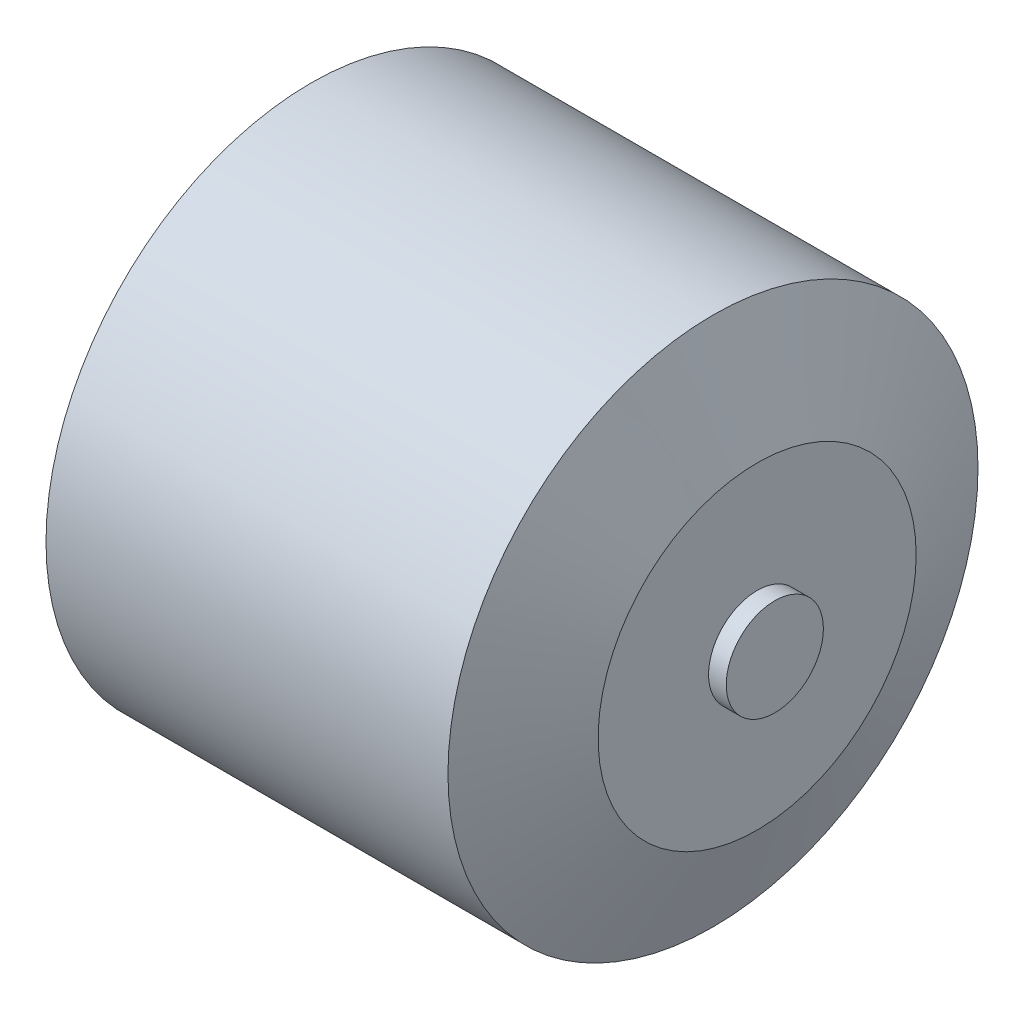
ISO-10303-21;
HEADER;
FILE_DESCRIPTION(('STEP AP214'),'2;1');
FILE_NAME('part.step','',(''),(''),'','','');
FILE_SCHEMA(('AUTOMOTIVE_DESIGN { 1 0 10303 214 1 1 1 1 }'));
ENDSEC;
DATA;
#1=APPLICATION_CONTEXT('core data for automotive mechanical design processes');
#2=APPLICATION_PROTOCOL_DEFINITION('international standard','automotive_design',2000,#1);
#3=PRODUCT_CONTEXT('',#1,'mechanical');
#4=PRODUCT('Part','Part','',(#3));
#5=PRODUCT_RELATED_PRODUCT_CATEGORY('part','',(#4));
#6=PRODUCT_DEFINITION_FORMATION('','',#4);
#7=PRODUCT_DEFINITION_CONTEXT('part definition',#1,'design');
#8=PRODUCT_DEFINITION('design','',#6,#7);
#9=PRODUCT_DEFINITION_SHAPE('','',#8);
#10=(LENGTH_UNIT() NAMED_UNIT(*) SI_UNIT(.MILLI.,.METRE.));
#11=(NAMED_UNIT(*) PLANE_ANGLE_UNIT() SI_UNIT($,.RADIAN.));
#12=(NAMED_UNIT(*) SI_UNIT($,.STERADIAN.) SOLID_ANGLE_UNIT());
#13=UNCERTAINTY_MEASURE_WITH_UNIT(LENGTH_MEASURE(1.E-05),#10,'distance_accuracy_value','');
#14=(GEOMETRIC_REPRESENTATION_CONTEXT(3) GLOBAL_UNCERTAINTY_ASSIGNED_CONTEXT((#13)) GLOBAL_UNIT_ASSIGNED_CONTEXT((#10,
#11,#12)) REPRESENTATION_CONTEXT('',''));
#15=CARTESIAN_POINT('',(0.,0.,0.));
#16=DIRECTION('',(0.,0.,1.));
#17=DIRECTION('',(1.,0.,0.));
#18=AXIS2_PLACEMENT_3D('',#15,#16,#17);
#19=CARTESIAN_POINT('',(95.,0.,0.));
#20=DIRECTION('',(-1.,0.,0.));
#21=DIRECTION('',(0.,0.,1.));
#22=AXIS2_PLACEMENT_3D('',#19,#20,#21);
#23=CYLINDRICAL_SURFACE('',#22,60.);
#24=CARTESIAN_POINT('',(95.,0.,0.));
#25=DIRECTION('',(1.,0.,0.));
#26=DIRECTION('',(0.,0.,-1.));
#27=AXIS2_PLACEMENT_3D('',#24,#25,#26);
#28=CIRCLE('',#27,60.);
#29=CARTESIAN_POINT('',(95.,0.,-60.));
#30=VERTEX_POINT('',#29);
#31=EDGE_CURVE('E56',#30,#30,#28,.T.);
#32=ORIENTED_EDGE('',*,*,#31,.F.);
#33=EDGE_LOOP('',(#32));
#34=FACE_BOUND('',#33,.T.);
#35=CARTESIAN_POINT('',(4.,0.,0.));
#36=DIRECTION('',(1.,0.,0.));
#37=DIRECTION('',(0.,0.,-1.));
#38=AXIS2_PLACEMENT_3D('',#35,#36,#37);
#39=CIRCLE('',#38,60.);
#40=CARTESIAN_POINT('',(4.,0.,-60.));
#41=VERTEX_POINT('',#40);
#42=EDGE_CURVE('E50',#41,#41,#39,.T.);
#43=ORIENTED_EDGE('',*,*,#42,.T.);
#44=EDGE_LOOP('',(#43));
#45=FACE_BOUND('',#44,.T.);
#46=ADVANCED_FACE('F47',(#34,#45),#23,.T.);
#47=CARTESIAN_POINT('',(4.,0.,0.));
#48=DIRECTION('',(1.,0.,0.));
#49=DIRECTION('',(0.,0.,-1.));
#50=AXIS2_PLACEMENT_3D('',#47,#48,#49);
#51=PLANE('',#50);
#52=CARTESIAN_POINT('',(4.,0.,0.));
#53=DIRECTION('',(-1.,0.,0.));
#54=DIRECTION('',(0.,0.,1.));
#55=AXIS2_PLACEMENT_3D('',#52,#53,#54);
#56=CIRCLE('',#55,47.5);
#57=CARTESIAN_POINT('',(4.,0.,47.5));
#58=VERTEX_POINT('',#57);
#59=EDGE_CURVE('E11',#58,#58,#56,.T.);
#60=ORIENTED_EDGE('',*,*,#59,.F.);
#61=EDGE_LOOP('',(#60));
#62=FACE_BOUND('',#61,.T.);
#63=ORIENTED_EDGE('',*,*,#42,.F.);
#64=EDGE_LOOP('',(#63));
#65=FACE_BOUND('',#64,.T.);
#66=ADVANCED_FACE('F246',(#62,#65),#51,.F.);
#67=CARTESIAN_POINT('',(109.,0.,0.));
#68=DIRECTION('',(1.,0.,0.));
#69=DIRECTION('',(0.,0.,-1.));
#70=AXIS2_PLACEMENT_3D('',#67,#68,#69);
#71=PLANE('',#70);
#72=CARTESIAN_POINT('',(109.,0.,0.));
#73=DIRECTION('',(1.,0.,0.));
#74=DIRECTION('',(0.,0.,-1.));
#75=AXIS2_PLACEMENT_3D('',#72,#73,#74);
#76=CIRCLE('',#75,11.);
#77=CARTESIAN_POINT('',(109.,0.,-11.));
#78=VERTEX_POINT('',#77);
#79=EDGE_CURVE('E234',#78,#78,#76,.T.);
#80=ORIENTED_EDGE('',*,*,#79,.T.);
#81=EDGE_LOOP('',(#80));
#82=FACE_BOUND('',#81,.T.);
#83=ADVANCED_FACE('F248',(#82),#71,.T.);
#84=CARTESIAN_POINT('',(95.,0.,0.));
#85=DIRECTION('',(1.,0.,0.));
#86=DIRECTION('',(0.,0.,-1.));
#87=AXIS2_PLACEMENT_3D('',#84,#85,#86);
#88=CYLINDRICAL_SURFACE('',#87,11.);
#89=CARTESIAN_POINT('',(105.,0.,0.));
#90=DIRECTION('',(1.,0.,0.));
#91=DIRECTION('',(0.,0.,-1.));
#92=AXIS2_PLACEMENT_3D('',#89,#90,#91);
#93=CIRCLE('',#92,11.);
#94=CARTESIAN_POINT('',(105.,0.,-11.));
#95=VERTEX_POINT('',#94);
#96=EDGE_CURVE('E230',#95,#95,#93,.T.);
#97=ORIENTED_EDGE('',*,*,#96,.T.);
#98=EDGE_LOOP('',(#97));
#99=FACE_BOUND('',#98,.T.);
#100=ORIENTED_EDGE('',*,*,#79,.F.);
#101=EDGE_LOOP('',(#100));
#102=FACE_BOUND('',#101,.T.);
#103=ADVANCED_FACE('F257',(#99,#102),#88,.T.);
#104=CARTESIAN_POINT('',(105.,36.,0.));
#105=DIRECTION('',(1.,0.,0.));
#106=DIRECTION('',(0.,0.,-1.));
#107=AXIS2_PLACEMENT_3D('',#104,#105,#106);
#108=PLANE('',#107);
#109=CARTESIAN_POINT('',(105.,0.,0.));
#110=DIRECTION('',(1.,0.,0.));
#111=DIRECTION('',(0.,0.,-1.));
#112=AXIS2_PLACEMENT_3D('',#109,#110,#111);
#113=CIRCLE('',#112,36.);
#114=CARTESIAN_POINT('',(105.,0.,-36.));
#115=VERTEX_POINT('',#114);
#116=EDGE_CURVE('E225',#115,#115,#113,.T.);
#117=ORIENTED_EDGE('',*,*,#116,.T.);
#118=EDGE_LOOP('',(#117));
#119=FACE_BOUND('',#118,.T.);
#120=ORIENTED_EDGE('',*,*,#96,.F.);
#121=EDGE_LOOP('',(#120));
#122=FACE_BOUND('',#121,.T.);
#123=ADVANCED_FACE('F338',(#119,#122),#108,.T.);
#124=CARTESIAN_POINT('',(105.,0.,0.));
#125=DIRECTION('',(-1.,0.,0.));
#126=DIRECTION('',(0.,0.,1.));
#127=AXIS2_PLACEMENT_3D('',#124,#125,#126);
#128=CONICAL_SURFACE('',#127,36.,1.17600520709514);
#129=ORIENTED_EDGE('',*,*,#31,.T.);
#130=EDGE_LOOP('',(#129));
#131=FACE_BOUND('',#130,.T.);
#132=ORIENTED_EDGE('',*,*,#116,.F.);
#133=EDGE_LOOP('',(#132));
#134=FACE_BOUND('',#133,.T.);
#135=ADVANCED_FACE('F333',(#131,#134),#128,.T.);
#136=CARTESIAN_POINT('',(0.,0.,0.));
#137=DIRECTION('',(-1.,0.,0.));
#138=DIRECTION('',(0.,0.,1.));
#139=AXIS2_PLACEMENT_3D('',#136,#137,#138);
#140=PLANE('',#139);
#141=CARTESIAN_POINT('',(0.,0.,0.));
#142=DIRECTION('',(-1.,0.,0.));
#143=DIRECTION('',(0.,0.,1.));
#144=AXIS2_PLACEMENT_3D('',#141,#142,#143);
#145=CIRCLE('',#144,5.99999999999999);
#146=CARTESIAN_POINT('',(0.,0.,5.99999999999999));
#147=VERTEX_POINT('',#146);
#148=EDGE_CURVE('E130',#147,#147,#145,.T.);
#149=ORIENTED_EDGE('',*,*,#148,.F.);
#150=EDGE_LOOP('',(#149));
#151=FACE_BOUND('',#150,.T.);
#152=CARTESIAN_POINT('',(0.,7.76457135307562,28.9777747886721));
#153=DIRECTION('',(-1.,0.,0.));
#154=DIRECTION('',(0.,0.,1.));
#155=AXIS2_PLACEMENT_3D('',#152,#153,#154);
#156=CIRCLE('',#155,2.25);
#157=CARTESIAN_POINT('',(0.,7.76457135307562,31.2277747886721));
#158=VERTEX_POINT('',#157);
#159=EDGE_CURVE('E151',#158,#158,#156,.T.);
#160=ORIENTED_EDGE('',*,*,#159,.F.);
#161=EDGE_LOOP('',(#160));
#162=FACE_BOUND('',#161,.T.);
#163=CARTESIAN_POINT('',(0.,28.9777747886721,7.76457135307562));
#164=DIRECTION('',(-1.,0.,0.));
#165=DIRECTION('',(0.,0.,1.));
#166=AXIS2_PLACEMENT_3D('',#163,#164,#165);
#167=CIRCLE('',#166,2.24999999999999);
#168=CARTESIAN_POINT('',(0.,28.9777747886721,10.0145713530756));
#169=VERTEX_POINT('',#168);
#170=EDGE_CURVE('E167',#169,#169,#167,.T.);
#171=ORIENTED_EDGE('',*,*,#170,.F.);
#172=EDGE_LOOP('',(#171));
#173=FACE_BOUND('',#172,.T.);
#174=CARTESIAN_POINT('',(0.,21.2132034355964,-21.2132034355964));
#175=DIRECTION('',(-1.,0.,0.));
#176=DIRECTION('',(0.,0.,1.));
#177=AXIS2_PLACEMENT_3D('',#174,#175,#176);
#178=CIRCLE('',#177,2.25);
#179=CARTESIAN_POINT('',(0.,21.2132034355964,-18.9632034355964));
#180=VERTEX_POINT('',#179);
#181=EDGE_CURVE('E183',#180,#180,#178,.T.);
#182=ORIENTED_EDGE('',*,*,#181,.F.);
#183=EDGE_LOOP('',(#182));
#184=FACE_BOUND('',#183,.T.);
#185=CARTESIAN_POINT('',(0.,-7.76457135307565,-28.977774788672));
#186=DIRECTION('',(-1.,0.,0.));
#187=DIRECTION('',(0.,0.,1.));
#188=AXIS2_PLACEMENT_3D('',#185,#186,#187);
#189=CIRCLE('',#188,2.25);
#190=CARTESIAN_POINT('',(0.,-7.76457135307565,-26.727774788672));
#191=VERTEX_POINT('',#190);
#192=EDGE_CURVE('E199',#191,#191,#189,.T.);
#193=ORIENTED_EDGE('',*,*,#192,.F.);
#194=EDGE_LOOP('',(#193));
#195=FACE_BOUND('',#194,.T.);
#196=CARTESIAN_POINT('',(0.,-21.2132034355964,21.2132034355964));
#197=DIRECTION('',(-1.,0.,0.));
#198=DIRECTION('',(0.,0.,1.));
#199=AXIS2_PLACEMENT_3D('',#196,#197,#198);
#200=CIRCLE('',#199,2.25);
#201=CARTESIAN_POINT('',(0.,-21.2132034355964,23.4632034355964));
#202=VERTEX_POINT('',#201);
#203=EDGE_CURVE('E215',#202,#202,#200,.T.);
#204=ORIENTED_EDGE('',*,*,#203,.F.);
#205=EDGE_LOOP('',(#204));
#206=FACE_BOUND('',#205,.T.);
#207=CARTESIAN_POINT('',(0.,0.,0.));
#208=DIRECTION('',(-1.,0.,0.));
#209=DIRECTION('',(0.,0.,1.));
#210=AXIS2_PLACEMENT_3D('',#207,#208,#209);
#211=CIRCLE('',#210,47.5);
#212=CARTESIAN_POINT('',(0.,0.,47.5));
#213=VERTEX_POINT('',#212);
#214=EDGE_CURVE('E219',#213,#213,#211,.T.);
#215=ORIENTED_EDGE('',*,*,#214,.T.);
#216=EDGE_LOOP('',(#215));
#217=FACE_BOUND('',#216,.T.);
#218=CARTESIAN_POINT('',(0.,-21.2132034355964,-21.2132034355964));
#219=DIRECTION('',(-1.,0.,0.));
#220=DIRECTION('',(0.,0.,1.));
#221=AXIS2_PLACEMENT_3D('',#218,#219,#220);
#222=CIRCLE('',#221,2.25);
#223=CARTESIAN_POINT('',(0.,-21.2132034355964,-18.9632034355964));
#224=VERTEX_POINT('',#223);
#225=EDGE_CURVE('E207',#224,#224,#222,.T.);
#226=ORIENTED_EDGE('',*,*,#225,.F.);
#227=EDGE_LOOP('',(#226));
#228=FACE_BOUND('',#227,.T.);
#229=CARTESIAN_POINT('',(0.,7.76457135307559,-28.977774788672));
#230=DIRECTION('',(-1.,0.,0.));
#231=DIRECTION('',(0.,0.,1.));
#232=AXIS2_PLACEMENT_3D('',#229,#230,#231);
#233=CIRCLE('',#232,2.25000000000001);
#234=CARTESIAN_POINT('',(0.,7.76457135307559,-26.727774788672));
#235=VERTEX_POINT('',#234);
#236=EDGE_CURVE('E191',#235,#235,#233,.T.);
#237=ORIENTED_EDGE('',*,*,#236,.F.);
#238=EDGE_LOOP('',(#237));
#239=FACE_BOUND('',#238,.T.);
#240=CARTESIAN_POINT('',(0.,28.977774788672,-7.76457135307565));
#241=DIRECTION('',(-1.,0.,0.));
#242=DIRECTION('',(0.,0.,1.));
#243=AXIS2_PLACEMENT_3D('',#240,#241,#242);
#244=CIRCLE('',#243,2.24999999999998);
#245=CARTESIAN_POINT('',(0.,28.977774788672,-5.51457135307567));
#246=VERTEX_POINT('',#245);
#247=EDGE_CURVE('E175',#246,#246,#244,.T.);
#248=ORIENTED_EDGE('',*,*,#247,.F.);
#249=EDGE_LOOP('',(#248));
#250=FACE_BOUND('',#249,.T.);
#251=CARTESIAN_POINT('',(0.,21.2132034355964,21.2132034355964));
#252=DIRECTION('',(-1.,0.,0.));
#253=DIRECTION('',(0.,0.,1.));
#254=AXIS2_PLACEMENT_3D('',#251,#252,#253);
#255=CIRCLE('',#254,2.25);
#256=CARTESIAN_POINT('',(0.,21.2132034355964,23.4632034355964));
#257=VERTEX_POINT('',#256);
#258=EDGE_CURVE('E159',#257,#257,#255,.T.);
#259=ORIENTED_EDGE('',*,*,#258,.F.);
#260=EDGE_LOOP('',(#259));
#261=FACE_BOUND('',#260,.T.);
#262=CARTESIAN_POINT('',(0.,-7.76457135307562,28.9777747886721));
#263=DIRECTION('',(-1.,0.,0.));
#264=DIRECTION('',(0.,0.,1.));
#265=AXIS2_PLACEMENT_3D('',#262,#263,#264);
#266=CIRCLE('',#265,2.25);
#267=CARTESIAN_POINT('',(0.,-7.76457135307562,31.2277747886721));
#268=VERTEX_POINT('',#267);
#269=EDGE_CURVE('E143',#268,#268,#266,.T.);
#270=ORIENTED_EDGE('',*,*,#269,.F.);
#271=EDGE_LOOP('',(#270));
#272=FACE_BOUND('',#271,.T.);
#273=ADVANCED_FACE('F331',(#151,#162,#173,#184,#195,#206,#217,#228,#239,#250,#261,#272),#140,.T.);
#274=CARTESIAN_POINT('',(0.,0.,0.));
#275=DIRECTION('',(1.,0.,0.));
#276=DIRECTION('',(0.,0.,-1.));
#277=AXIS2_PLACEMENT_3D('',#274,#275,#276);
#278=CYLINDRICAL_SURFACE('',#277,47.5);
#279=ORIENTED_EDGE('',*,*,#214,.F.);
#280=EDGE_LOOP('',(#279));
#281=FACE_BOUND('',#280,.T.);
#282=ORIENTED_EDGE('',*,*,#59,.T.);
#283=EDGE_LOOP('',(#282));
#284=FACE_BOUND('',#283,.T.);
#285=ADVANCED_FACE('F329',(#281,#284),#278,.T.);
#286=CARTESIAN_POINT('',(0.,-21.2132034355964,21.2132034355964));
#287=DIRECTION('',(1.,0.,0.));
#288=DIRECTION('',(0.,0.,-1.));
#289=AXIS2_PLACEMENT_3D('',#286,#287,#288);
#290=CYLINDRICAL_SURFACE('',#289,2.25);
#291=ORIENTED_EDGE('',*,*,#203,.T.);
#292=EDGE_LOOP('',(#291));
#293=FACE_BOUND('',#292,.T.);
#294=CARTESIAN_POINT('',(4.,-21.2132034355964,21.2132034355964));
#295=DIRECTION('',(-1.,0.,0.));
#296=DIRECTION('',(0.,0.,1.));
#297=AXIS2_PLACEMENT_3D('',#294,#295,#296);
#298=CIRCLE('',#297,2.25);
#299=CARTESIAN_POINT('',(4.,-21.2132034355964,23.4632034355964));
#300=VERTEX_POINT('',#299);
#301=EDGE_CURVE('E211',#300,#300,#298,.T.);
#302=ORIENTED_EDGE('',*,*,#301,.F.);
#303=EDGE_LOOP('',(#302));
#304=FACE_BOUND('',#303,.T.);
#305=ADVANCED_FACE('F325',(#293,#304),#290,.F.);
#306=CARTESIAN_POINT('',(0.,-21.2132034355964,-21.2132034355964));
#307=DIRECTION('',(1.,0.,0.));
#308=DIRECTION('',(0.,0.,-1.));
#309=AXIS2_PLACEMENT_3D('',#306,#307,#308);
#310=CYLINDRICAL_SURFACE('',#309,2.25);
#311=ORIENTED_EDGE('',*,*,#225,.T.);
#312=EDGE_LOOP('',(#311));
#313=FACE_BOUND('',#312,.T.);
#314=CARTESIAN_POINT('',(4.,-21.2132034355964,-21.2132034355964));
#315=DIRECTION('',(-1.,0.,0.));
#316=DIRECTION('',(0.,0.,1.));
#317=AXIS2_PLACEMENT_3D('',#314,#315,#316);
#318=CIRCLE('',#317,2.25);
#319=CARTESIAN_POINT('',(4.,-21.2132034355964,-18.9632034355964));
#320=VERTEX_POINT('',#319);
#321=EDGE_CURVE('E203',#320,#320,#318,.T.);
#322=ORIENTED_EDGE('',*,*,#321,.F.);
#323=EDGE_LOOP('',(#322));
#324=FACE_BOUND('',#323,.T.);
#325=ADVANCED_FACE('F321',(#313,#324),#310,.F.);
#326=CARTESIAN_POINT('',(0.,-7.76457135307565,-28.977774788672));
#327=DIRECTION('',(1.,0.,0.));
#328=DIRECTION('',(0.,0.,-1.));
#329=AXIS2_PLACEMENT_3D('',#326,#327,#328);
#330=CYLINDRICAL_SURFACE('',#329,2.25);
#331=ORIENTED_EDGE('',*,*,#192,.T.);
#332=EDGE_LOOP('',(#331));
#333=FACE_BOUND('',#332,.T.);
#334=CARTESIAN_POINT('',(4.,-7.76457135307565,-28.977774788672));
#335=DIRECTION('',(-1.,0.,0.));
#336=DIRECTION('',(0.,0.,1.));
#337=AXIS2_PLACEMENT_3D('',#334,#335,#336);
#338=CIRCLE('',#337,2.25);
#339=CARTESIAN_POINT('',(4.,-7.76457135307565,-26.727774788672));
#340=VERTEX_POINT('',#339);
#341=EDGE_CURVE('E195',#340,#340,#338,.T.);
#342=ORIENTED_EDGE('',*,*,#341,.F.);
#343=EDGE_LOOP('',(#342));
#344=FACE_BOUND('',#343,.T.);
#345=ADVANCED_FACE('F317',(#333,#344),#330,.F.);
#346=CARTESIAN_POINT('',(0.,7.76457135307559,-28.977774788672));
#347=DIRECTION('',(1.,0.,0.));
#348=DIRECTION('',(0.,0.,-1.));
#349=AXIS2_PLACEMENT_3D('',#346,#347,#348);
#350=CYLINDRICAL_SURFACE('',#349,2.25000000000001);
#351=ORIENTED_EDGE('',*,*,#236,.T.);
#352=EDGE_LOOP('',(#351));
#353=FACE_BOUND('',#352,.T.);
#354=CARTESIAN_POINT('',(4.,7.76457135307559,-28.977774788672));
#355=DIRECTION('',(-1.,0.,0.));
#356=DIRECTION('',(0.,0.,1.));
#357=AXIS2_PLACEMENT_3D('',#354,#355,#356);
#358=CIRCLE('',#357,2.25000000000001);
#359=CARTESIAN_POINT('',(4.,7.76457135307559,-26.727774788672));
#360=VERTEX_POINT('',#359);
#361=EDGE_CURVE('E187',#360,#360,#358,.T.);
#362=ORIENTED_EDGE('',*,*,#361,.F.);
#363=EDGE_LOOP('',(#362));
#364=FACE_BOUND('',#363,.T.);
#365=ADVANCED_FACE('F313',(#353,#364),#350,.F.);
#366=CARTESIAN_POINT('',(0.,21.2132034355964,-21.2132034355964));
#367=DIRECTION('',(1.,0.,0.));
#368=DIRECTION('',(0.,0.,-1.));
#369=AXIS2_PLACEMENT_3D('',#366,#367,#368);
#370=CYLINDRICAL_SURFACE('',#369,2.25);
#371=ORIENTED_EDGE('',*,*,#181,.T.);
#372=EDGE_LOOP('',(#371));
#373=FACE_BOUND('',#372,.T.);
#374=CARTESIAN_POINT('',(4.,21.2132034355964,-21.2132034355964));
#375=DIRECTION('',(-1.,0.,0.));
#376=DIRECTION('',(0.,0.,1.));
#377=AXIS2_PLACEMENT_3D('',#374,#375,#376);
#378=CIRCLE('',#377,2.25);
#379=CARTESIAN_POINT('',(4.,21.2132034355964,-18.9632034355964));
#380=VERTEX_POINT('',#379);
#381=EDGE_CURVE('E179',#380,#380,#378,.T.);
#382=ORIENTED_EDGE('',*,*,#381,.F.);
#383=EDGE_LOOP('',(#382));
#384=FACE_BOUND('',#383,.T.);
#385=ADVANCED_FACE('F309',(#373,#384),#370,.F.);
#386=CARTESIAN_POINT('',(0.,28.977774788672,-7.76457135307565));
#387=DIRECTION('',(1.,0.,0.));
#388=DIRECTION('',(0.,0.,-1.));
#389=AXIS2_PLACEMENT_3D('',#386,#387,#388);
#390=CYLINDRICAL_SURFACE('',#389,2.24999999999998);
#391=ORIENTED_EDGE('',*,*,#247,.T.);
#392=EDGE_LOOP('',(#391));
#393=FACE_BOUND('',#392,.T.);
#394=CARTESIAN_POINT('',(4.,28.977774788672,-7.76457135307565));
#395=DIRECTION('',(-1.,0.,0.));
#396=DIRECTION('',(0.,0.,1.));
#397=AXIS2_PLACEMENT_3D('',#394,#395,#396);
#398=CIRCLE('',#397,2.24999999999998);
#399=CARTESIAN_POINT('',(4.,28.977774788672,-5.51457135307567));
#400=VERTEX_POINT('',#399);
#401=EDGE_CURVE('E171',#400,#400,#398,.T.);
#402=ORIENTED_EDGE('',*,*,#401,.F.);
#403=EDGE_LOOP('',(#402));
#404=FACE_BOUND('',#403,.T.);
#405=ADVANCED_FACE('F305',(#393,#404),#390,.F.);
#406=CARTESIAN_POINT('',(0.,28.9777747886721,7.76457135307562));
#407=DIRECTION('',(1.,0.,0.));
#408=DIRECTION('',(0.,0.,-1.));
#409=AXIS2_PLACEMENT_3D('',#406,#407,#408);
#410=CYLINDRICAL_SURFACE('',#409,2.24999999999999);
#411=ORIENTED_EDGE('',*,*,#170,.T.);
#412=EDGE_LOOP('',(#411));
#413=FACE_BOUND('',#412,.T.);
#414=CARTESIAN_POINT('',(4.,28.9777747886721,7.76457135307562));
#415=DIRECTION('',(-1.,0.,0.));
#416=DIRECTION('',(0.,0.,1.));
#417=AXIS2_PLACEMENT_3D('',#414,#415,#416);
#418=CIRCLE('',#417,2.24999999999999);
#419=CARTESIAN_POINT('',(4.,28.9777747886721,10.0145713530756));
#420=VERTEX_POINT('',#419);
#421=EDGE_CURVE('E163',#420,#420,#418,.T.);
#422=ORIENTED_EDGE('',*,*,#421,.F.);
#423=EDGE_LOOP('',(#422));
#424=FACE_BOUND('',#423,.T.);
#425=ADVANCED_FACE('F299',(#413,#424),#410,.F.);
#426=CARTESIAN_POINT('',(0.,21.2132034355964,21.2132034355964));
#427=DIRECTION('',(1.,0.,0.));
#428=DIRECTION('',(0.,0.,-1.));
#429=AXIS2_PLACEMENT_3D('',#426,#427,#428);
#430=CYLINDRICAL_SURFACE('',#429,2.25);
#431=ORIENTED_EDGE('',*,*,#258,.T.);
#432=EDGE_LOOP('',(#431));
#433=FACE_BOUND('',#432,.T.);
#434=CARTESIAN_POINT('',(4.,21.2132034355964,21.2132034355964));
#435=DIRECTION('',(-1.,0.,0.));
#436=DIRECTION('',(0.,0.,1.));
#437=AXIS2_PLACEMENT_3D('',#434,#435,#436);
#438=CIRCLE('',#437,2.25);
#439=CARTESIAN_POINT('',(4.,21.2132034355964,23.4632034355964));
#440=VERTEX_POINT('',#439);
#441=EDGE_CURVE('E155',#440,#440,#438,.T.);
#442=ORIENTED_EDGE('',*,*,#441,.F.);
#443=EDGE_LOOP('',(#442));
#444=FACE_BOUND('',#443,.T.);
#445=ADVANCED_FACE('F293',(#433,#444),#430,.F.);
#446=CARTESIAN_POINT('',(0.,7.76457135307562,28.9777747886721));
#447=DIRECTION('',(1.,0.,0.));
#448=DIRECTION('',(0.,0.,-1.));
#449=AXIS2_PLACEMENT_3D('',#446,#447,#448);
#450=CYLINDRICAL_SURFACE('',#449,2.25);
#451=ORIENTED_EDGE('',*,*,#159,.T.);
#452=EDGE_LOOP('',(#451));
#453=FACE_BOUND('',#452,.T.);
#454=CARTESIAN_POINT('',(4.,7.76457135307562,28.9777747886721));
#455=DIRECTION('',(-1.,0.,0.));
#456=DIRECTION('',(0.,0.,1.));
#457=AXIS2_PLACEMENT_3D('',#454,#455,#456);
#458=CIRCLE('',#457,2.25);
#459=CARTESIAN_POINT('',(4.,7.76457135307562,31.2277747886721));
#460=VERTEX_POINT('',#459);
#461=EDGE_CURVE('E147',#460,#460,#458,.T.);
#462=ORIENTED_EDGE('',*,*,#461,.F.);
#463=EDGE_LOOP('',(#462));
#464=FACE_BOUND('',#463,.T.);
#465=ADVANCED_FACE('F287',(#453,#464),#450,.F.);
#466=CARTESIAN_POINT('',(0.,-7.76457135307562,28.9777747886721));
#467=DIRECTION('',(1.,0.,0.));
#468=DIRECTION('',(0.,0.,-1.));
#469=AXIS2_PLACEMENT_3D('',#466,#467,#468);
#470=CYLINDRICAL_SURFACE('',#469,2.25);
#471=ORIENTED_EDGE('',*,*,#269,.T.);
#472=EDGE_LOOP('',(#471));
#473=FACE_BOUND('',#472,.T.);
#474=CARTESIAN_POINT('',(4.,-7.76457135307562,28.9777747886721));
#475=DIRECTION('',(-1.,0.,0.));
#476=DIRECTION('',(0.,0.,1.));
#477=AXIS2_PLACEMENT_3D('',#474,#475,#476);
#478=CIRCLE('',#477,2.25);
#479=CARTESIAN_POINT('',(4.,-7.76457135307562,31.2277747886721));
#480=VERTEX_POINT('',#479);
#481=EDGE_CURVE('E139',#480,#480,#478,.T.);
#482=ORIENTED_EDGE('',*,*,#481,.F.);
#483=EDGE_LOOP('',(#482));
#484=FACE_BOUND('',#483,.T.);
#485=ADVANCED_FACE('F279',(#473,#484),#470,.F.);
#486=ORIENTED_EDGE('',*,*,#461,.T.);
#487=EDGE_LOOP('',(#486));
#488=FACE_BOUND('',#487,.T.);
#489=ADVANCED_FACE('F269',(#488),#51,.F.);
#490=ORIENTED_EDGE('',*,*,#441,.T.);
#491=EDGE_LOOP('',(#490));
#492=FACE_BOUND('',#491,.T.);
#493=ADVANCED_FACE('F278',(#492),#51,.F.);
#494=ORIENTED_EDGE('',*,*,#421,.T.);
#495=EDGE_LOOP('',(#494));
#496=FACE_BOUND('',#495,.T.);
#497=ADVANCED_FACE('F285',(#496),#51,.F.);
#498=ORIENTED_EDGE('',*,*,#401,.T.);
#499=EDGE_LOOP('',(#498));
#500=FACE_BOUND('',#499,.T.);
#501=ADVANCED_FACE('F385',(#500),#51,.F.);
#502=ORIENTED_EDGE('',*,*,#381,.T.);
#503=EDGE_LOOP('',(#502));
#504=FACE_BOUND('',#503,.T.);
#505=ADVANCED_FACE('F393',(#504),#51,.F.);
#506=ORIENTED_EDGE('',*,*,#361,.T.);
#507=EDGE_LOOP('',(#506));
#508=FACE_BOUND('',#507,.T.);
#509=ADVANCED_FACE('F401',(#508),#51,.F.);
#510=ORIENTED_EDGE('',*,*,#341,.T.);
#511=EDGE_LOOP('',(#510));
#512=FACE_BOUND('',#511,.T.);
#513=ADVANCED_FACE('F409',(#512),#51,.F.);
#514=ORIENTED_EDGE('',*,*,#321,.T.);
#515=EDGE_LOOP('',(#514));
#516=FACE_BOUND('',#515,.T.);
#517=ADVANCED_FACE('F264',(#516),#51,.F.);
#518=ORIENTED_EDGE('',*,*,#301,.T.);
#519=EDGE_LOOP('',(#518));
#520=FACE_BOUND('',#519,.T.);
#521=ADVANCED_FACE('F250',(#520),#51,.F.);
#522=ORIENTED_EDGE('',*,*,#481,.T.);
#523=EDGE_LOOP('',(#522));
#524=FACE_BOUND('',#523,.T.);
#525=ADVANCED_FACE('F251',(#524),#51,.F.);
#526=CARTESIAN_POINT('',(-20.,0.,0.));
#527=DIRECTION('',(1.,0.,0.));
#528=DIRECTION('',(0.,0.,-1.));
#529=AXIS2_PLACEMENT_3D('',#526,#527,#528);
#530=CYLINDRICAL_SURFACE('',#529,5.99999999999999);
#531=CARTESIAN_POINT('',(-5.,0.,0.));
#532=DIRECTION('',(-1.,0.,0.));
#533=DIRECTION('',(0.,0.,1.));
#534=AXIS2_PLACEMENT_3D('',#531,#532,#533);
#535=CIRCLE('',#534,5.99999999999999);
#536=CARTESIAN_POINT('',(-5.,-1.99999999999999,5.65685424949237));
#537=VERTEX_POINT('',#536);
#538=CARTESIAN_POINT('',(-5.,2.,5.65685424949237));
#539=VERTEX_POINT('',#538);
#540=EDGE_CURVE('E113',#537,#539,#535,.T.);
#541=ORIENTED_EDGE('',*,*,#540,.F.);
#542=DIRECTION('',(-1.,0.,0.));
#543=VECTOR('',#542,1.);
#544=CARTESIAN_POINT('',(-5.,-1.99999999999999,5.65685424949237));
#545=LINE('',#544,#543);
#546=CARTESIAN_POINT('',(-20.,-1.99999999999999,5.65685424949237));
#547=VERTEX_POINT('',#546);
#548=EDGE_CURVE('E73',#537,#547,#545,.T.);
#549=ORIENTED_EDGE('',*,*,#548,.T.);
#550=CARTESIAN_POINT('',(-20.,0.,0.));
#551=DIRECTION('',(-1.,0.,0.));
#552=DIRECTION('',(0.,0.,1.));
#553=AXIS2_PLACEMENT_3D('',#550,#551,#552);
#554=CIRCLE('',#553,5.99999999999999);
#555=CARTESIAN_POINT('',(-20.,2.,5.65685424949237));
#556=VERTEX_POINT('',#555);
#557=EDGE_CURVE('E135',#556,#547,#554,.T.);
#558=ORIENTED_EDGE('',*,*,#557,.F.);
#559=DIRECTION('',(-1.,0.,0.));
#560=VECTOR('',#559,1.);
#561=CARTESIAN_POINT('',(-5.,2.,5.65685424949237));
#562=LINE('',#561,#560);
#563=EDGE_CURVE('E64',#539,#556,#562,.T.);
#564=ORIENTED_EDGE('',*,*,#563,.F.);
#565=EDGE_LOOP('',(#541,#549,#558,#564));
#566=FACE_BOUND('',#565,.T.);
#567=ORIENTED_EDGE('',*,*,#148,.T.);
#568=EDGE_LOOP('',(#567));
#569=FACE_BOUND('',#568,.T.);
#570=ADVANCED_FACE('F267',(#566,#569),#530,.T.);
#571=CARTESIAN_POINT('',(-20.,0.,0.));
#572=DIRECTION('',(-1.,0.,0.));
#573=DIRECTION('',(0.,0.,1.));
#574=AXIS2_PLACEMENT_3D('',#571,#572,#573);
#575=PLANE('',#574);
#576=DIRECTION('',(0.,0.,1.));
#577=VECTOR('',#576,1.);
#578=CARTESIAN_POINT('',(-20.,-1.99999999999999,5.65685424949237));
#579=LINE('',#578,#577);
#580=CARTESIAN_POINT('',(-20.,-2.,3.99999999999999));
#581=VERTEX_POINT('',#580);
#582=EDGE_CURVE('E88',#581,#547,#579,.T.);
#583=ORIENTED_EDGE('',*,*,#582,.F.);
#584=DIRECTION('',(0.,-1.,0.));
#585=VECTOR('',#584,1.);
#586=CARTESIAN_POINT('',(-20.,2.,3.99999999999999));
#587=LINE('',#586,#585);
#588=CARTESIAN_POINT('',(-20.,2.,3.99999999999999));
#589=VERTEX_POINT('',#588);
#590=EDGE_CURVE('E123',#589,#581,#587,.T.);
#591=ORIENTED_EDGE('',*,*,#590,.F.);
#592=DIRECTION('',(0.,0.,-1.));
#593=VECTOR('',#592,1.);
#594=CARTESIAN_POINT('',(-20.,2.,5.65685424949237));
#595=LINE('',#594,#593);
#596=EDGE_CURVE('E97',#556,#589,#595,.T.);
#597=ORIENTED_EDGE('',*,*,#596,.F.);
#598=ORIENTED_EDGE('',*,*,#557,.T.);
#599=EDGE_LOOP('',(#583,#591,#597,#598));
#600=FACE_BOUND('',#599,.T.);
#601=ADVANCED_FACE('F274',(#600),#575,.T.);
#602=CARTESIAN_POINT('',(-5.,-1.99999999999999,5.65685424949237));
#603=DIRECTION('',(0.,-1.,0.));
#604=DIRECTION('',(0.,0.,-1.));
#605=AXIS2_PLACEMENT_3D('',#602,#603,#604);
#606=PLANE('',#605);
#607=ORIENTED_EDGE('',*,*,#582,.T.);
#608=ORIENTED_EDGE('',*,*,#548,.F.);
#609=DIRECTION('',(0.,0.,1.));
#610=VECTOR('',#609,1.);
#611=CARTESIAN_POINT('',(-5.,-1.99999999999999,5.65685424949237));
#612=LINE('',#611,#610);
#613=CARTESIAN_POINT('',(-5.,-2.,3.99999999999999));
#614=VERTEX_POINT('',#613);
#615=EDGE_CURVE('E109',#614,#537,#612,.T.);
#616=ORIENTED_EDGE('',*,*,#615,.F.);
#617=DIRECTION('',(-1.,0.,0.));
#618=VECTOR('',#617,1.);
#619=CARTESIAN_POINT('',(-5.,-2.,3.99999999999999));
#620=LINE('',#619,#618);
#621=EDGE_CURVE('E102',#614,#581,#620,.T.);
#622=ORIENTED_EDGE('',*,*,#621,.T.);
#623=EDGE_LOOP('',(#607,#608,#616,#622));
#624=FACE_BOUND('',#623,.T.);
#625=ADVANCED_FACE('F512',(#624),#606,.F.);
#626=CARTESIAN_POINT('',(-5.,2.,3.99999999999999));
#627=DIRECTION('',(0.,0.,-1.));
#628=DIRECTION('',(-1.,0.,0.));
#629=AXIS2_PLACEMENT_3D('',#626,#627,#628);
#630=PLANE('',#629);
#631=ORIENTED_EDGE('',*,*,#590,.T.);
#632=ORIENTED_EDGE('',*,*,#621,.F.);
#633=DIRECTION('',(0.,-1.,0.));
#634=VECTOR('',#633,1.);
#635=CARTESIAN_POINT('',(-5.,2.,3.99999999999999));
#636=LINE('',#635,#634);
#637=CARTESIAN_POINT('',(-5.,2.,3.99999999999999));
#638=VERTEX_POINT('',#637);
#639=EDGE_CURVE('E105',#638,#614,#636,.T.);
#640=ORIENTED_EDGE('',*,*,#639,.F.);
#641=DIRECTION('',(-1.,0.,0.));
#642=VECTOR('',#641,1.);
#643=CARTESIAN_POINT('',(-5.,2.,3.99999999999999));
#644=LINE('',#643,#642);
#645=EDGE_CURVE('E94',#638,#589,#644,.T.);
#646=ORIENTED_EDGE('',*,*,#645,.T.);
#647=EDGE_LOOP('',(#631,#632,#640,#646));
#648=FACE_BOUND('',#647,.T.);
#649=ADVANCED_FACE('F106',(#648),#630,.F.);
#650=CARTESIAN_POINT('',(-5.,2.,5.65685424949237));
#651=DIRECTION('',(0.,1.,0.));
#652=DIRECTION('',(0.,0.,1.));
#653=AXIS2_PLACEMENT_3D('',#650,#651,#652);
#654=PLANE('',#653);
#655=ORIENTED_EDGE('',*,*,#596,.T.);
#656=ORIENTED_EDGE('',*,*,#645,.F.);
#657=DIRECTION('',(0.,0.,-1.));
#658=VECTOR('',#657,1.);
#659=CARTESIAN_POINT('',(-5.,2.,5.65685424949237));
#660=LINE('',#659,#658);
#661=EDGE_CURVE('E92',#539,#638,#660,.T.);
#662=ORIENTED_EDGE('',*,*,#661,.F.);
#663=ORIENTED_EDGE('',*,*,#563,.T.);
#664=EDGE_LOOP('',(#655,#656,#662,#663));
#665=FACE_BOUND('',#664,.T.);
#666=ADVANCED_FACE('F96',(#665),#654,.F.);
#667=CARTESIAN_POINT('',(-5.,0.,0.));
#668=DIRECTION('',(-1.,0.,0.));
#669=DIRECTION('',(0.,0.,1.));
#670=AXIS2_PLACEMENT_3D('',#667,#668,#669);
#671=PLANE('',#670);
#672=ORIENTED_EDGE('',*,*,#540,.T.);
#673=ORIENTED_EDGE('',*,*,#661,.T.);
#674=ORIENTED_EDGE('',*,*,#639,.T.);
#675=ORIENTED_EDGE('',*,*,#615,.T.);
#676=EDGE_LOOP('',(#672,#673,#674,#675));
#677=FACE_BOUND('',#676,.T.);
#678=ADVANCED_FACE('F111',(#677),#671,.T.);
#679=CLOSED_SHELL('',(#46,#66,#83,#103,#123,#135,#273,#285,#305,#325,#345,#365,#385,#405,#425,
#445,#465,#485,#489,#493,#497,#501,#505,#509,#513,#517,#521,#525,#570,#601,#625,#649,#666,#678));
#680=MANIFOLD_SOLID_BREP('B2',#679);
#681=ADVANCED_BREP_SHAPE_REPRESENTATION('',(#18,#680),#14);
#682=SHAPE_DEFINITION_REPRESENTATION(#9,#681);
ENDSEC;
END-ISO-10303-21;
